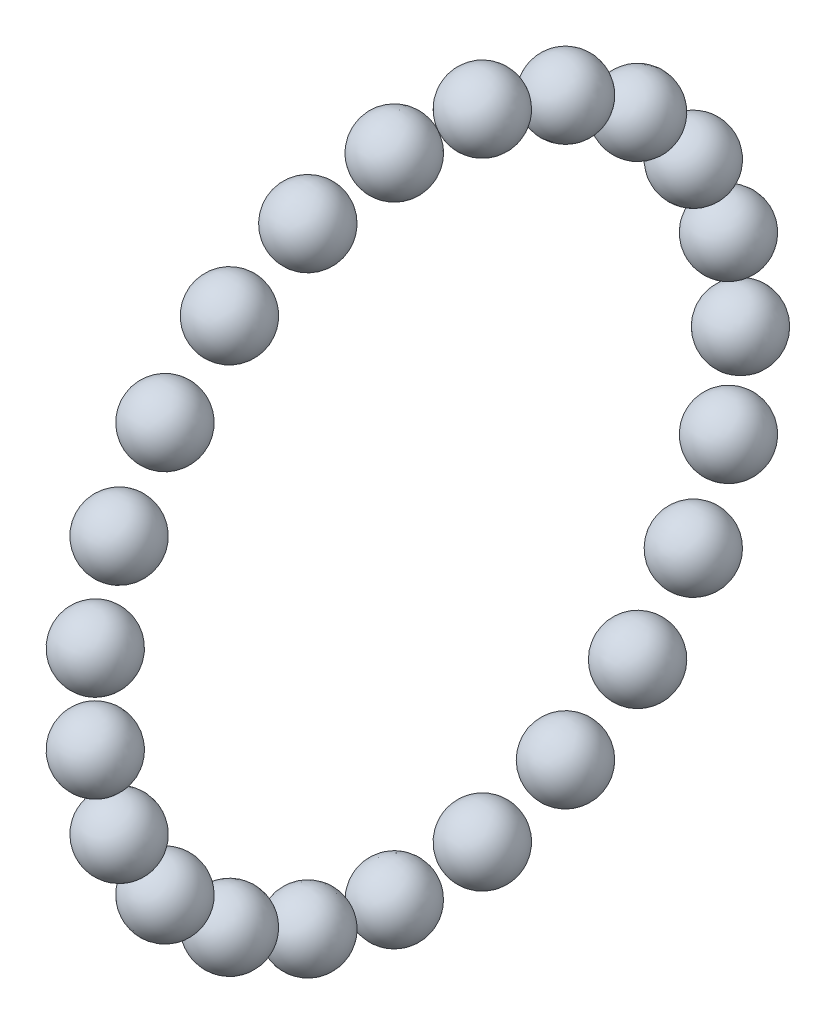
ISO-10303-21;
HEADER;
FILE_DESCRIPTION(('STEP AP214'),'2;1');
FILE_NAME('part.step','',(''),(''),'','','');
FILE_SCHEMA(('AUTOMOTIVE_DESIGN { 1 0 10303 214 1 1 1 1 }'));
ENDSEC;
DATA;
#1=APPLICATION_CONTEXT('core data for automotive mechanical design processes');
#2=APPLICATION_PROTOCOL_DEFINITION('international standard','automotive_design',2000,#1);
#3=PRODUCT_CONTEXT('',#1,'mechanical');
#4=PRODUCT('Part','Part','',(#3));
#5=PRODUCT_RELATED_PRODUCT_CATEGORY('part','',(#4));
#6=PRODUCT_DEFINITION_FORMATION('','',#4);
#7=PRODUCT_DEFINITION_CONTEXT('part definition',#1,'design');
#8=PRODUCT_DEFINITION('design','',#6,#7);
#9=PRODUCT_DEFINITION_SHAPE('','',#8);
#10=(LENGTH_UNIT() NAMED_UNIT(*) SI_UNIT(.MILLI.,.METRE.));
#11=(NAMED_UNIT(*) PLANE_ANGLE_UNIT() SI_UNIT($,.RADIAN.));
#12=(NAMED_UNIT(*) SI_UNIT($,.STERADIAN.) SOLID_ANGLE_UNIT());
#13=UNCERTAINTY_MEASURE_WITH_UNIT(LENGTH_MEASURE(1.E-05),#10,'distance_accuracy_value','');
#14=(GEOMETRIC_REPRESENTATION_CONTEXT(3) GLOBAL_UNCERTAINTY_ASSIGNED_CONTEXT((#13)) GLOBAL_UNIT_ASSIGNED_CONTEXT((#10,
#11,#12)) REPRESENTATION_CONTEXT('',''));
#15=CARTESIAN_POINT('',(0.,0.,0.));
#16=DIRECTION('',(0.,0.,1.));
#17=DIRECTION('',(1.,0.,0.));
#18=AXIS2_PLACEMENT_3D('',#15,#16,#17);
#19=CARTESIAN_POINT('',(0.,-9.32116893769589,11.4572557637042));
#20=DIRECTION('',(0.,0.775711290704415,0.631087944326059));
#21=DIRECTION('',(0.,-0.631087944326059,0.775711290704415));
#22=AXIS2_PLACEMENT_3D('',#19,#20,#21);
#23=SPHERICAL_SURFACE('',#22,1.5875);
#24=CARTESIAN_POINT('',(0.,-10.3230210493135,12.6886974376975));
#25=VERTEX_POINT('',#24);
#26=VERTEX_LOOP('',#25);
#27=FACE_BOUND('',#26,.T.);
#28=ADVANCED_FACE('P0_F14',(#27),#23,.T.);
#29=CLOSED_SHELL('',(#28));
#30=MANIFOLD_SOLID_BREP('P0_B1',#29);
#31=CARTESIAN_POINT('',(0.,-5.88438409702909,13.5472109232355));
#32=DIRECTION('',(0.,0.91721130150545,0.398401089846248));
#33=DIRECTION('',(0.,0.398401089846248,-0.91721130150545));
#34=AXIS2_PLACEMENT_3D('',#31,#32,#33);
#35=SPHERICAL_SURFACE('',#34,1.5875);
#36=CARTESIAN_POINT('',(0.,-5.25192236689817,12.0911379820956));
#37=VERTEX_POINT('',#36);
#38=VERTEX_LOOP('',#37);
#39=FACE_BOUND('',#38,.T.);
#40=ADVANCED_FACE('P1_F14',(#39),#35,.T.);
#41=CLOSED_SHELL('',(#40));
#42=MANIFOLD_SOLID_BREP('P1_B1',#41);
#43=CARTESIAN_POINT('',(0.,13.1140646758031,-6.79516060728909));
#44=DIRECTION('',(0.,-0.46006503773115,-0.887885218402377));
#45=DIRECTION('',(0.,-0.887885218402377,0.46006503773115));
#46=AXIS2_PLACEMENT_3D('',#43,#44,#45);
#47=SPHERICAL_SURFACE('',#46,1.5875);
#48=CARTESIAN_POINT('',(0.,11.7045468915893,-6.06480735989089));
#49=VERTEX_POINT('',#48);
#50=VERTEX_LOOP('',#49);
#51=FACE_BOUND('',#50,.T.);
#52=ADVANCED_FACE('P2_F14',(#51),#47,.T.);
#53=CLOSED_SHELL('',(#52));
#54=MANIFOLD_SOLID_BREP('P2_B1',#53);
#55=CARTESIAN_POINT('',(0.,10.7944471923879,-10.0813099253395));
#56=DIRECTION('',(0.,-0.682553143218652,-0.730835964278126));
#57=DIRECTION('',(0.,0.730835964278126,-0.682553143218652));
#58=AXIS2_PLACEMENT_3D('',#55,#56,#57);
#59=SPHERICAL_SURFACE('',#58,1.5875);
#60=CARTESIAN_POINT('',(0.,11.9546492856794,-11.1648630401991));
#61=VERTEX_POINT('',#60);
#62=VERTEX_LOOP('',#61);
#63=FACE_BOUND('',#62,.T.);
#64=ADVANCED_FACE('P3_F14',(#63),#59,.T.);
#65=CLOSED_SHELL('',(#64));
#66=MANIFOLD_SOLID_BREP('P3_B1',#65);
#67=CARTESIAN_POINT('',(0.,13.917193819695,4.94617187176552));
#68=DIRECTION('',(0.,0.334879612170988,-0.94226092211882));
#69=DIRECTION('',(0.,0.94226092211882,0.334879612170989));
#70=AXIS2_PLACEMENT_3D('',#67,#68,#69);
#71=SPHERICAL_SURFACE('',#70,1.5875);
#72=CARTESIAN_POINT('',(0.,15.4130330335586,5.47779325608697));
#73=VERTEX_POINT('',#72);
#74=VERTEX_LOOP('',#73);
#75=FACE_BOUND('',#74,.T.);
#76=ADVANCED_FACE('P4_F14',(#75),#71,.T.);
#77=CLOSED_SHELL('',(#76));
#78=MANIFOLD_SOLID_BREP('P4_B1',#77);
#79=CARTESIAN_POINT('',(0.,-3.98489830998907,-14.222288334127));
#80=DIRECTION('',(0.,-0.962917287347803,0.269796771157011));
#81=DIRECTION('',(0.,-0.269796771157012,-0.962917287347803));
#82=AXIS2_PLACEMENT_3D('',#79,#80,#81);
#83=SPHERICAL_SURFACE('',#82,1.5875);
#84=CARTESIAN_POINT('',(0.,-4.41320068420083,-15.7509195277916));
#85=VERTEX_POINT('',#84);
#86=VERTEX_LOOP('',#85);
#87=FACE_BOUND('',#86,.T.);
#88=ADVANCED_FACE('P5_F14',(#87),#83,.T.);
#89=CLOSED_SHELL('',(#88));
#90=MANIFOLD_SOLID_BREP('P5_B1',#89);
#91=CARTESIAN_POINT('',(0.,-10.7944471923878,-10.0813099253396));
#92=DIRECTION('',(0.,-0.682553143218662,0.730835964278117));
#93=DIRECTION('',(0.,0.730835964278117,0.682553143218662));
#94=AXIS2_PLACEMENT_3D('',#91,#92,#93);
#95=SPHERICAL_SURFACE('',#94,1.5875);
#96=CARTESIAN_POINT('',(0.,-9.63424509909629,-8.99775681047997));
#97=VERTEX_POINT('',#96);
#98=VERTEX_LOOP('',#97);
#99=FACE_BOUND('',#98,.T.);
#100=ADVANCED_FACE('P6_F14',(#99),#95,.T.);
#101=CLOSED_SHELL('',(#100));
#102=MANIFOLD_SOLID_BREP('P6_B1',#101);
#103=CARTESIAN_POINT('',(0.,2.01118140715147,14.6324314229566));
#104=DIRECTION('',(0.,0.990685946036332,-0.136166649096241));
#105=DIRECTION('',(0.,-0.136166649096241,-0.990685946036332));
#106=AXIS2_PLACEMENT_3D('',#103,#104,#105);
#107=SPHERICAL_SURFACE('',#106,1.5875);
#108=CARTESIAN_POINT('',(0.,1.79501685171119,13.0597174836239));
#109=VERTEX_POINT('',#108);
#110=VERTEX_LOOP('',#109);
#111=FACE_BOUND('',#110,.T.);
#112=ADVANCED_FACE('P7_F14',(#111),#107,.T.);
#113=CLOSED_SHELL('',(#112));
#114=MANIFOLD_SOLID_BREP('P7_B1',#113);
#115=CARTESIAN_POINT('',(0.,-14.4610719750679,-3.00504531278755));
#116=DIRECTION('',(0.,-0.203456013052644,0.979084087682321));
#117=DIRECTION('',(0.,-0.979084087682321,-0.203456013052644));
#118=AXIS2_PLACEMENT_3D('',#115,#116,#117);
#119=SPHERICAL_SURFACE('',#118,1.5875);
#120=CARTESIAN_POINT('',(0.,-16.0153679642636,-3.32803173350862));
#121=VERTEX_POINT('',#120);
#122=VERTEX_LOOP('',#121);
#123=FACE_BOUND('',#122,.T.);
#124=ADVANCED_FACE('P8_F14',(#123),#119,.T.);
#125=CLOSED_SHELL('',(#124));
#126=MANIFOLD_SOLID_BREP('P8_B1',#125);
#127=CARTESIAN_POINT('',(0.,14.4610719750679,-3.00504531278736));
#128=DIRECTION('',(0.,-0.20345601305263,-0.979084087682324));
#129=DIRECTION('',(0.,-0.979084087682324,0.20345601305263));
#130=AXIS2_PLACEMENT_3D('',#127,#128,#129);
#131=SPHERICAL_SURFACE('',#130,1.5875);
#132=CARTESIAN_POINT('',(0.,12.9067759858722,-2.68205889206631));
#133=VERTEX_POINT('',#132);
#134=VERTEX_LOOP('',#133);
#135=FACE_BOUND('',#134,.T.);
#136=ADVANCED_FACE('P9_F14',(#135),#131,.T.);
#137=CLOSED_SHELL('',(#136));
#138=MANIFOLD_SOLID_BREP('P9_B1',#137);
#139=CARTESIAN_POINT('',(0.,12.0666453197642,8.51756835763664));
#140=DIRECTION('',(0.,0.576680322114871,-0.81696989301044));
#141=DIRECTION('',(0.,-0.81696989301044,-0.576680322114871));
#142=AXIS2_PLACEMENT_3D('',#139,#140,#141);
#143=SPHERICAL_SURFACE('',#142,1.5875);
#144=CARTESIAN_POINT('',(0.,10.7697056146101,7.60208834627928));
#145=VERTEX_POINT('',#144);
#146=VERTEX_LOOP('',#145);
#147=FACE_BOUND('',#146,.T.);
#148=ADVANCED_FACE('P10_F14',(#147),#143,.T.);
#149=CLOSED_SHELL('',(#148));
#150=MANIFOLD_SOLID_BREP('P10_B1',#149);
#151=CARTESIAN_POINT('',(0.,9.32116893769575,11.4572557637043));
#152=DIRECTION('',(0.,0.775711290704424,-0.631087944326048));
#153=DIRECTION('',(0.,-0.631087944326048,-0.775711290704424));
#154=AXIS2_PLACEMENT_3D('',#151,#152,#153);
#155=SPHERICAL_SURFACE('',#154,1.5875);
#156=CARTESIAN_POINT('',(0.,8.31931682607815,10.225814089711));
#157=VERTEX_POINT('',#156);
#158=VERTEX_LOOP('',#157);
#159=FACE_BOUND('',#158,.T.);
#160=ADVANCED_FACE('P11_F14',(#159),#155,.T.);
#161=CLOSED_SHELL('',(#160));
#162=MANIFOLD_SOLID_BREP('P11_B1',#161);
#163=CARTESIAN_POINT('',(0.,-13.917193819695,4.94617187176534));
#164=DIRECTION('',(0.,0.33487961217098,0.942260922118823));
#165=DIRECTION('',(0.,0.942260922118823,-0.334879612170979));
#166=AXIS2_PLACEMENT_3D('',#163,#164,#165);
#167=SPHERICAL_SURFACE('',#166,1.5875);
#168=CARTESIAN_POINT('',(0.,-12.4213546058314,4.41455048744391));
#169=VERTEX_POINT('',#168);
#170=VERTEX_LOOP('',#169);
#171=FACE_BOUND('',#170,.T.);
#172=ADVANCED_FACE('P12_F14',(#171),#167,.T.);
#173=CLOSED_SHELL('',(#172));
#174=MANIFOLD_SOLID_BREP('P12_B1',#173);
#175=CARTESIAN_POINT('',(0.,-2.01118140715166,14.6324314229566));
#176=DIRECTION('',(0.,0.99068594603633,0.136166649096253));
#177=DIRECTION('',(0.,0.136166649096253,-0.99068594603633));
#178=AXIS2_PLACEMENT_3D('',#175,#176,#177);
#179=SPHERICAL_SURFACE('',#178,1.5875);
#180=CARTESIAN_POINT('',(0.,-1.79501685171136,13.0597174836239));
#181=VERTEX_POINT('',#180);
#182=VERTEX_LOOP('',#181);
#183=FACE_BOUND('',#182,.T.);
#184=ADVANCED_FACE('P13_F14',(#183),#179,.T.);
#185=CLOSED_SHELL('',(#184));
#186=MANIFOLD_SOLID_BREP('P13_B1',#185);
#187=CARTESIAN_POINT('',(0.,-12.0666453197643,8.5175683576365));
#188=DIRECTION('',(0.,0.576680322114861,0.816969893010446));
#189=DIRECTION('',(0.,0.816969893010446,-0.576680322114861));
#190=AXIS2_PLACEMENT_3D('',#187,#188,#189);
#191=SPHERICAL_SURFACE('',#190,1.5875);
#192=CARTESIAN_POINT('',(0.,-10.7697056146102,7.60208834627916));
#193=VERTEX_POINT('',#192);
#194=VERTEX_LOOP('',#193);
#195=FACE_BOUND('',#194,.T.);
#196=ADVANCED_FACE('P14_F14',(#195),#191,.T.);
#197=CLOSED_SHELL('',(#196));
#198=MANIFOLD_SOLID_BREP('P14_B1',#197);
#199=CARTESIAN_POINT('',(0.,5.88438409702891,13.5472109232356));
#200=DIRECTION('',(0.,0.917211301505455,-0.398401089846236));
#201=DIRECTION('',(0.,-0.398401089846236,-0.917211301505455));
#202=AXIS2_PLACEMENT_3D('',#199,#200,#201);
#203=SPHERICAL_SURFACE('',#202,1.5875);
#204=CARTESIAN_POINT('',(0.,5.25192236689801,12.0911379820957));
#205=VERTEX_POINT('',#204);
#206=VERTEX_LOOP('',#205);
#207=FACE_BOUND('',#206,.T.);
#208=ADVANCED_FACE('P15_F14',(#207),#203,.T.);
#209=CLOSED_SHELL('',(#208));
#210=MANIFOLD_SOLID_BREP('P15_B1',#209);
#211=CARTESIAN_POINT('',(0.,-13.114064675803,-6.79516060728925));
#212=DIRECTION('',(0.,-0.460065037731161,0.887885218402371));
#213=DIRECTION('',(0.,0.887885218402371,0.460065037731161));
#214=AXIS2_PLACEMENT_3D('',#211,#212,#213);
#215=SPHERICAL_SURFACE('',#214,1.5875);
#216=CARTESIAN_POINT('',(0.,-11.7045468915892,-6.06480735989103));
#217=VERTEX_POINT('',#216);
#218=VERTEX_LOOP('',#217);
#219=FACE_BOUND('',#218,.T.);
#220=ADVANCED_FACE('P16_F14',(#219),#215,.T.);
#221=CLOSED_SHELL('',(#220));
#222=MANIFOLD_SOLID_BREP('P16_B1',#221);
#223=CARTESIAN_POINT('',(0.,0.,-14.77));
#224=DIRECTION('',(0.,-1.,0.));
#225=DIRECTION('',(0.,0.,-1.));
#226=AXIS2_PLACEMENT_3D('',#223,#224,#225);
#227=SPHERICAL_SURFACE('',#226,1.5875);
#228=CARTESIAN_POINT('',(0.,0.,-16.3575));
#229=VERTEX_POINT('',#228);
#230=VERTEX_LOOP('',#229);
#231=FACE_BOUND('',#230,.T.);
#232=ADVANCED_FACE('P17_F14',(#231),#227,.T.);
#233=CLOSED_SHELL('',(#232));
#234=MANIFOLD_SOLID_BREP('P17_B1',#233);
#235=CARTESIAN_POINT('',(0.,7.67425494202337,-12.6197746051516));
#236=DIRECTION('',(0.,-0.854419404546488,-0.519583950035435));
#237=DIRECTION('',(0.,-0.519583950035435,0.854419404546488));
#238=AXIS2_PLACEMENT_3D('',#235,#236,#237);
#239=SPHERICAL_SURFACE('',#238,1.5875);
#240=CARTESIAN_POINT('',(0.,6.84941542134212,-11.2633838004341));
#241=VERTEX_POINT('',#240);
#242=VERTEX_LOOP('',#241);
#243=FACE_BOUND('',#242,.T.);
#244=ADVANCED_FACE('P18_F14',(#243),#239,.T.);
#245=CLOSED_SHELL('',(#244));
#246=MANIFOLD_SOLID_BREP('P18_B1',#245);
#247=CARTESIAN_POINT('',(0.,14.7355677209443,1.00794044539624));
#248=DIRECTION('',(0.,0.0682424133646742,-0.997668769190539));
#249=DIRECTION('',(0.,0.997668769190539,0.0682424133646742));
#250=AXIS2_PLACEMENT_3D('',#247,#248,#249);
#251=SPHERICAL_SURFACE('',#250,1.5875);
#252=CARTESIAN_POINT('',(0.,16.3193668920343,1.11627527661266));
#253=VERTEX_POINT('',#252);
#254=VERTEX_LOOP('',#253);
#255=FACE_BOUND('',#254,.T.);
#256=ADVANCED_FACE('P19_F14',(#255),#251,.T.);
#257=CLOSED_SHELL('',(#256));
#258=MANIFOLD_SOLID_BREP('P19_B1',#257);
#259=CARTESIAN_POINT('',(0.,-7.67425494202321,-12.6197746051517));
#260=DIRECTION('',(0.,-0.854419404546494,0.519583950035425));
#261=DIRECTION('',(0.,0.519583950035424,0.854419404546494));
#262=AXIS2_PLACEMENT_3D('',#259,#260,#261);
#263=SPHERICAL_SURFACE('',#262,1.5875);
#264=CARTESIAN_POINT('',(0.,-6.84941542134197,-11.2633838004341));
#265=VERTEX_POINT('',#264);
#266=VERTEX_LOOP('',#265);
#267=FACE_BOUND('',#266,.T.);
#268=ADVANCED_FACE('P20_F14',(#267),#263,.T.);
#269=CLOSED_SHELL('',(#268));
#270=MANIFOLD_SOLID_BREP('P20_B1',#269);
#271=CARTESIAN_POINT('',(0.,3.98489830998926,-14.222288334127));
#272=DIRECTION('',(0.,-0.962917287347799,-0.269796771157024));
#273=DIRECTION('',(0.,0.269796771157024,-0.962917287347799));
#274=AXIS2_PLACEMENT_3D('',#271,#272,#273);
#275=SPHERICAL_SURFACE('',#274,1.5875);
#276=CARTESIAN_POINT('',(0.,4.41320068420104,-15.7509195277916));
#277=VERTEX_POINT('',#276);
#278=VERTEX_LOOP('',#277);
#279=FACE_BOUND('',#278,.T.);
#280=ADVANCED_FACE('P21_F14',(#279),#275,.T.);
#281=CLOSED_SHELL('',(#280));
#282=MANIFOLD_SOLID_BREP('P21_B1',#281);
#283=CARTESIAN_POINT('',(0.,-14.7355677209443,1.00794044539605));
#284=DIRECTION('',(0.,0.0682424133646621,0.99766876919054));
#285=DIRECTION('',(0.,0.99766876919054,-0.0682424133646622));
#286=AXIS2_PLACEMENT_3D('',#283,#284,#285);
#287=SPHERICAL_SURFACE('',#286,1.5875);
#288=CARTESIAN_POINT('',(0.,-13.1517685498543,0.899605614179649));
#289=VERTEX_POINT('',#288);
#290=VERTEX_LOOP('',#289);
#291=FACE_BOUND('',#290,.T.);
#292=ADVANCED_FACE('P22_F14',(#291),#287,.T.);
#293=CLOSED_SHELL('',(#292));
#294=MANIFOLD_SOLID_BREP('P22_B1',#293);
#295=ADVANCED_BREP_SHAPE_REPRESENTATION('',(#18,#30,#42,#54,#66,#78,#90,#102,#114,#126,#138,
#150,#162,#174,#186,#198,#210,#222,#234,#246,#258,#270,#282,#294),#14);
#296=SHAPE_DEFINITION_REPRESENTATION(#9,#295);
ENDSEC;
END-ISO-10303-21;
